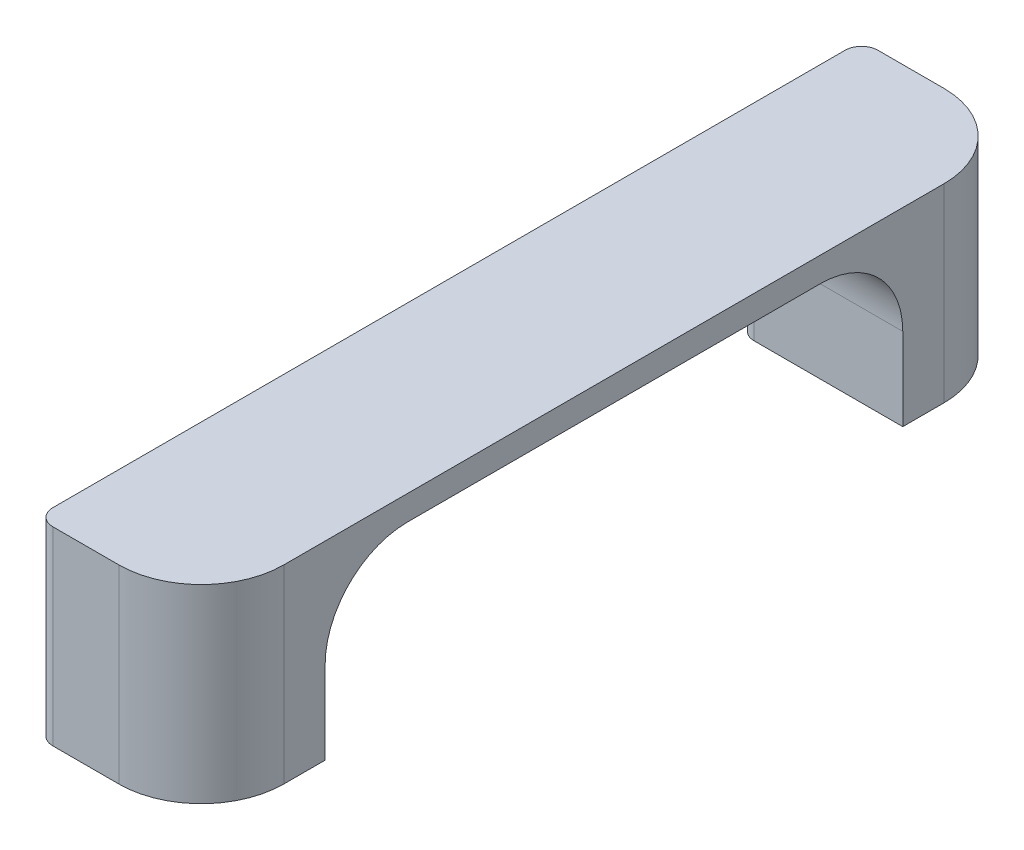
ISO-10303-21;
HEADER;
FILE_DESCRIPTION(('STEP AP214'),'2;1');
FILE_NAME('part.step','',(''),(''),'','','');
FILE_SCHEMA(('AUTOMOTIVE_DESIGN { 1 0 10303 214 1 1 1 1 }'));
ENDSEC;
DATA;
#1=APPLICATION_CONTEXT('core data for automotive mechanical design processes');
#2=APPLICATION_PROTOCOL_DEFINITION('international standard','automotive_design',2000,#1);
#3=PRODUCT_CONTEXT('',#1,'mechanical');
#4=PRODUCT('Part','Part','',(#3));
#5=PRODUCT_RELATED_PRODUCT_CATEGORY('part','',(#4));
#6=PRODUCT_DEFINITION_FORMATION('','',#4);
#7=PRODUCT_DEFINITION_CONTEXT('part definition',#1,'design');
#8=PRODUCT_DEFINITION('design','',#6,#7);
#9=PRODUCT_DEFINITION_SHAPE('','',#8);
#10=(LENGTH_UNIT() NAMED_UNIT(*) SI_UNIT(.MILLI.,.METRE.));
#11=(NAMED_UNIT(*) PLANE_ANGLE_UNIT() SI_UNIT($,.RADIAN.));
#12=(NAMED_UNIT(*) SI_UNIT($,.STERADIAN.) SOLID_ANGLE_UNIT());
#13=UNCERTAINTY_MEASURE_WITH_UNIT(LENGTH_MEASURE(1.E-05),#10,'distance_accuracy_value','');
#14=(GEOMETRIC_REPRESENTATION_CONTEXT(3) GLOBAL_UNCERTAINTY_ASSIGNED_CONTEXT((#13)) GLOBAL_UNIT_ASSIGNED_CONTEXT((#10,
#11,#12)) REPRESENTATION_CONTEXT('',''));
#15=CARTESIAN_POINT('',(0.,0.,0.));
#16=DIRECTION('',(0.,0.,1.));
#17=DIRECTION('',(1.,0.,0.));
#18=AXIS2_PLACEMENT_3D('',#15,#16,#17);
#19=CARTESIAN_POINT('',(0.,0.,0.));
#20=DIRECTION('',(0.,-1.,0.));
#21=DIRECTION('',(0.,0.,-1.));
#22=AXIS2_PLACEMENT_3D('',#19,#20,#21);
#23=PLANE('',#22);
#24=DIRECTION('',(0.,0.,1.));
#25=VECTOR('',#24,1.);
#26=CARTESIAN_POINT('',(0.,0.,0.));
#27=LINE('',#26,#25);
#28=CARTESIAN_POINT('',(0.,0.,-70.1678404338007));
#29=VERTEX_POINT('',#28);
#30=CARTESIAN_POINT('',(0.,0.,-19.8321595661992));
#31=VERTEX_POINT('',#30);
#32=EDGE_CURVE('E223',#29,#31,#27,.T.);
#33=ORIENTED_EDGE('',*,*,#32,.F.);
#34=CARTESIAN_POINT('',(1.99999999999998,0.,-82.));
#35=DIRECTION('',(0.,-1.,0.));
#36=DIRECTION('',(0.,0.,-1.));
#37=AXIS2_PLACEMENT_3D('',#34,#35,#36);
#38=CIRCLE('',#37,12.);
#39=CARTESIAN_POINT('',(1.99999999999998,0.,-70.));
#40=VERTEX_POINT('',#39);
#41=EDGE_CURVE('E303',#29,#40,#38,.F.);
#42=ORIENTED_EDGE('',*,*,#41,.T.);
#43=DIRECTION('',(-1.,0.,0.));
#44=VECTOR('',#43,1.);
#45=CARTESIAN_POINT('',(0.,0.,-70.));
#46=LINE('',#45,#44);
#47=CARTESIAN_POINT('',(20.,0.,-70.));
#48=VERTEX_POINT('',#47);
#49=EDGE_CURVE('E300',#40,#48,#46,.F.);
#50=ORIENTED_EDGE('',*,*,#49,.T.);
#51=DIRECTION('',(0.,0.,-1.));
#52=VECTOR('',#51,1.);
#53=CARTESIAN_POINT('',(20.,0.,0.));
#54=LINE('',#53,#52);
#55=CARTESIAN_POINT('',(20.,0.,-20.));
#56=VERTEX_POINT('',#55);
#57=EDGE_CURVE('E229',#56,#48,#54,.T.);
#58=ORIENTED_EDGE('',*,*,#57,.F.);
#59=DIRECTION('',(1.,0.,0.));
#60=VECTOR('',#59,1.);
#61=CARTESIAN_POINT('',(0.,0.,-20.));
#62=LINE('',#61,#60);
#63=CARTESIAN_POINT('',(2.,0.,-20.));
#64=VERTEX_POINT('',#63);
#65=EDGE_CURVE('E295',#56,#64,#62,.F.);
#66=ORIENTED_EDGE('',*,*,#65,.T.);
#67=CARTESIAN_POINT('',(2.,0.,-8.));
#68=DIRECTION('',(0.,-1.,0.));
#69=DIRECTION('',(0.,0.,-1.));
#70=AXIS2_PLACEMENT_3D('',#67,#68,#69);
#71=CIRCLE('',#70,12.);
#72=EDGE_CURVE('E297',#64,#31,#71,.F.);
#73=ORIENTED_EDGE('',*,*,#72,.T.);
#74=EDGE_LOOP('',(#33,#42,#50,#58,#66,#73));
#75=FACE_BOUND('',#74,.T.);
#76=ADVANCED_FACE('F41',(#75),#23,.T.);
#77=CARTESIAN_POINT('',(0.,3.,0.));
#78=DIRECTION('',(1.,0.,0.));
#79=DIRECTION('',(0.,0.,-1.));
#80=AXIS2_PLACEMENT_3D('',#77,#78,#79);
#81=PLANE('',#80);
#82=DIRECTION('',(0.,0.,-1.));
#83=VECTOR('',#82,1.);
#84=CARTESIAN_POINT('',(0.,-20.,0.));
#85=LINE('',#84,#83);
#86=CARTESIAN_POINT('',(0.,-20.,3.));
#87=VERTEX_POINT('',#86);
#88=CARTESIAN_POINT('',(0.,-20.,-8.));
#89=VERTEX_POINT('',#88);
#90=EDGE_CURVE('E211',#87,#89,#85,.T.);
#91=ORIENTED_EDGE('',*,*,#90,.F.);
#92=DIRECTION('',(0.,1.,0.));
#93=VECTOR('',#92,1.);
#94=CARTESIAN_POINT('',(0.,3.,3.));
#95=LINE('',#94,#93);
#96=CARTESIAN_POINT('',(0.,3.,3.));
#97=VERTEX_POINT('',#96);
#98=EDGE_CURVE('E267',#87,#97,#95,.T.);
#99=ORIENTED_EDGE('',*,*,#98,.T.);
#100=DIRECTION('',(0.,0.,1.));
#101=VECTOR('',#100,1.);
#102=CARTESIAN_POINT('',(0.,3.,0.));
#103=LINE('',#102,#101);
#104=CARTESIAN_POINT('',(0.,3.,-93.));
#105=VERTEX_POINT('',#104);
#106=EDGE_CURVE('E224',#105,#97,#103,.T.);
#107=ORIENTED_EDGE('',*,*,#106,.F.);
#108=DIRECTION('',(0.,1.,0.));
#109=VECTOR('',#108,1.);
#110=CARTESIAN_POINT('',(0.,-20.,-93.));
#111=LINE('',#110,#109);
#112=CARTESIAN_POINT('',(0.,-20.,-93.));
#113=VERTEX_POINT('',#112);
#114=EDGE_CURVE('E259',#105,#113,#111,.F.);
#115=ORIENTED_EDGE('',*,*,#114,.T.);
#116=DIRECTION('',(0.,0.,-1.));
#117=VECTOR('',#116,1.);
#118=CARTESIAN_POINT('',(0.,-20.,-90.));
#119=LINE('',#118,#117);
#120=CARTESIAN_POINT('',(0.,-20.,-82.));
#121=VERTEX_POINT('',#120);
#122=EDGE_CURVE('E201',#121,#113,#119,.T.);
#123=ORIENTED_EDGE('',*,*,#122,.F.);
#124=DIRECTION('',(0.,1.,0.));
#125=VECTOR('',#124,1.);
#126=CARTESIAN_POINT('',(0.,3.,-82.));
#127=LINE('',#126,#125);
#128=CARTESIAN_POINT('',(0.,-10.,-82.));
#129=VERTEX_POINT('',#128);
#130=EDGE_CURVE('E262',#121,#129,#127,.T.);
#131=ORIENTED_EDGE('',*,*,#130,.T.);
#132=CARTESIAN_POINT('',(0.,0.,-70.1678404338008));
#133=CARTESIAN_POINT('',(0.,2.10191415081182E-05,-70.4216609624393));
#134=CARTESIAN_POINT('',(0.,-0.00939418198005658,-70.6754685793764));
#135=CARTESIAN_POINT('',(0.,-0.0468394456368049,-71.1816480988663));
#136=CARTESIAN_POINT('',(0.,-0.0748650818075736,-71.4340203284241));
#137=CARTESIAN_POINT('',(0.,-0.149226810369676,-71.9357236716897));
#138=CARTESIAN_POINT('',(0.,-0.195539698017655,-72.1850582281866));
#139=CARTESIAN_POINT('',(0.,-0.306079157071367,-72.6797439580654));
#140=CARTESIAN_POINT('',(0.,-0.370307864719108,-72.9250946527266));
#141=CARTESIAN_POINT('',(0.,-0.527437110616089,-73.4480321232094));
#142=CARTESIAN_POINT('',(0.,-0.62323216760887,-73.7247532455665));
#143=CARTESIAN_POINT('',(0.,-0.837068688735033,-74.2694668622426));
#144=CARTESIAN_POINT('',(0.,-0.955112048587125,-74.5374586104709));
#145=CARTESIAN_POINT('',(0.,-1.21234150010652,-75.0631997515663));
#146=CARTESIAN_POINT('',(0.,-1.35153481445366,-75.3209456073946));
#147=CARTESIAN_POINT('',(0.,-1.64971285104091,-75.8247003285394));
#148=CARTESIAN_POINT('',(0.,-1.80869750674418,-76.0707092333108));
#149=CARTESIAN_POINT('',(0.,-2.15330502442141,-76.561689809982));
#150=CARTESIAN_POINT('',(0.,-2.33985588391826,-76.8060097765152));
#151=CARTESIAN_POINT('',(0.,-2.73129064220206,-77.2794756554535));
#152=CARTESIAN_POINT('',(0.,-2.93617543884392,-77.5086208237567));
#153=CARTESIAN_POINT('',(0.,-3.36228002974741,-77.9511187963036));
#154=CARTESIAN_POINT('',(0.,-3.58349902763464,-78.1644723694527));
#155=CARTESIAN_POINT('',(0.,-4.04021352179175,-78.5752419474623));
#156=CARTESIAN_POINT('',(0.,-4.27570832226231,-78.7726587279866));
#157=CARTESIAN_POINT('',(0.,-4.72070979725483,-79.121955559447));
#158=CARTESIAN_POINT('',(0.,-4.92844772588625,-79.2761034996471));
#159=CARTESIAN_POINT('',(0.,-5.35133788462005,-79.5738772645374));
#160=CARTESIAN_POINT('',(0.,-5.56649063685809,-79.7175023459956));
#161=CARTESIAN_POINT('',(0.,-6.00289683026443,-79.9949373439664));
#162=CARTESIAN_POINT('',(0.,-6.22414800720885,-80.1287508375475));
#163=CARTESIAN_POINT('',(0.,-6.67166291608455,-80.3876834714945));
#164=CARTESIAN_POINT('',(0.,-6.89792675741145,-80.5128024218648));
#165=CARTESIAN_POINT('',(0.,-7.52480673262205,-80.8463151793318));
#166=CARTESIAN_POINT('',(0.,-7.92944271616756,-81.0471205680418));
#167=CARTESIAN_POINT('',(0.,-8.74515020681244,-81.4347649429073));
#168=CARTESIAN_POINT('',(0.,-9.15622137932692,-81.621604652283));
#169=CARTESIAN_POINT('',(0.,-9.70592669129104,-81.8684757313831));
#170=CARTESIAN_POINT('',(0.,-9.84383253837145,-81.9301593362424));
#171=CARTESIAN_POINT('',(0.,-9.98782838700615,-81.9945566878116));
#172=CARTESIAN_POINT('',(0.,-9.99391419317435,-81.9972783430123));
#173=CARTESIAN_POINT('',(0.,-10.,-82.));
#174=B_SPLINE_CURVE_WITH_KNOTS('',3,(#132,#133,#134,#135,#136,#137,#138,#139,#140,#141,#142,
#143,#144,#145,#146,#147,#148,#149,#150,#151,#152,#153,#154,#155,#156,#157,#158,#159,#160,#161,
#162,#163,#164,#165,#166,#167,#168,#169,#170,#171,#172,#173),.UNSPECIFIED.,.F.,.F.,(4,2,2,2,2,2,
2,2,2,2,2,2,2,2,2,2,2,2,2,2,4),(0.,0.761267491588152,1.5223539857415,2.28247782270187,
3.04269233388829,3.92017736065048,4.79773718940725,5.67559737996917,6.55345461931779,
7.47468201635661,8.39595455272705,9.31718220205263,10.2383649870006,11.0140774355297,
11.7898446200946,12.5653275576832,13.3408274359997,14.6954553646361,16.0500130944704,
16.5032323799327,16.5232323799327),.UNSPECIFIED.);
#175=EDGE_CURVE('E316',#129,#29,#174,.F.);
#176=ORIENTED_EDGE('',*,*,#175,.T.);
#177=ORIENTED_EDGE('',*,*,#32,.T.);
#178=CARTESIAN_POINT('',(0.,0.,-19.8321595661992));
#179=CARTESIAN_POINT('',(0.,2.10191415088999E-05,-19.5783390375607));
#180=CARTESIAN_POINT('',(0.,-0.00939418198005515,-19.3245314206236));
#181=CARTESIAN_POINT('',(0.,-0.0468394456368029,-18.8183519011337));
#182=CARTESIAN_POINT('',(0.,-0.0748650818075717,-18.5659796715759));
#183=CARTESIAN_POINT('',(0.,-0.149226810369676,-18.0642763283103));
#184=CARTESIAN_POINT('',(0.,-0.195539698017655,-17.8149417718134));
#185=CARTESIAN_POINT('',(0.,-0.306079157071366,-17.3202560419346));
#186=CARTESIAN_POINT('',(0.,-0.370307864719105,-17.0749053472734));
#187=CARTESIAN_POINT('',(0.,-0.527437110616084,-16.5519678767906));
#188=CARTESIAN_POINT('',(0.,-0.623232167608868,-16.2752467544335));
#189=CARTESIAN_POINT('',(0.,-0.837068688735035,-15.7305331377574));
#190=CARTESIAN_POINT('',(0.,-0.955112048587129,-15.4625413895291));
#191=CARTESIAN_POINT('',(0.,-1.21234150010652,-14.9368002484337));
#192=CARTESIAN_POINT('',(0.,-1.35153481445366,-14.6790543926054));
#193=CARTESIAN_POINT('',(0.,-1.64971285104091,-14.1752996714606));
#194=CARTESIAN_POINT('',(0.,-1.80869750674418,-13.9292907666892));
#195=CARTESIAN_POINT('',(0.,-2.15330502442142,-13.438310190018));
#196=CARTESIAN_POINT('',(0.,-2.33985588391826,-13.1939902234848));
#197=CARTESIAN_POINT('',(0.,-2.73129064220206,-12.7205243445465));
#198=CARTESIAN_POINT('',(0.,-2.93617543884392,-12.4913791762433));
#199=CARTESIAN_POINT('',(0.,-3.36228002974741,-12.0488812036964));
#200=CARTESIAN_POINT('',(0.,-3.58349902763465,-11.8355276305473));
#201=CARTESIAN_POINT('',(0.,-4.04021352179176,-11.4247580525377));
#202=CARTESIAN_POINT('',(0.,-4.27570832226232,-11.2273412720134));
#203=CARTESIAN_POINT('',(0.,-4.72070979725484,-10.878044440553));
#204=CARTESIAN_POINT('',(0.,-4.92844772588626,-10.7238965003529));
#205=CARTESIAN_POINT('',(0.,-5.35133788462005,-10.4261227354626));
#206=CARTESIAN_POINT('',(0.,-5.56649063685809,-10.2824976540044));
#207=CARTESIAN_POINT('',(0.,-6.00289683026443,-10.0050626560336));
#208=CARTESIAN_POINT('',(0.,-6.22414800720885,-9.87124916245247));
#209=CARTESIAN_POINT('',(0.,-6.67166291608454,-9.61231652850553));
#210=CARTESIAN_POINT('',(0.,-6.89792675741145,-9.48719757813515));
#211=CARTESIAN_POINT('',(0.,-7.52480673262205,-9.1536848206682));
#212=CARTESIAN_POINT('',(0.,-7.92944271616756,-8.95287943195823));
#213=CARTESIAN_POINT('',(0.,-8.74515020681243,-8.5652350570927));
#214=CARTESIAN_POINT('',(0.,-9.1562213793269,-8.37839534771699));
#215=CARTESIAN_POINT('',(0.,-9.70592669129105,-8.13152426861689));
#216=CARTESIAN_POINT('',(0.,-9.84383253837147,-8.06984066375769));
#217=CARTESIAN_POINT('',(0.,-9.98782838700615,-8.00544331218838));
#218=CARTESIAN_POINT('',(0.,-9.99391419317435,-8.00272165698775));
#219=CARTESIAN_POINT('',(0.,-10.,-8.));
#220=B_SPLINE_CURVE_WITH_KNOTS('',3,(#178,#179,#180,#181,#182,#183,#184,#185,#186,#187,#188,
#189,#190,#191,#192,#193,#194,#195,#196,#197,#198,#199,#200,#201,#202,#203,#204,#205,#206,#207,
#208,#209,#210,#211,#212,#213,#214,#215,#216,#217,#218,#219),.UNSPECIFIED.,.F.,.F.,(4,2,2,2,2,2,
2,2,2,2,2,2,2,2,2,2,2,2,2,2,4),(0.,0.761267491588152,1.5223539857415,2.28247782270187,
3.04269233388829,3.92017736065048,4.79773718940725,5.67559737996917,6.5534546193178,
7.47468201635662,8.39595455272705,9.31718220205263,10.2383649870006,11.0140774355297,
11.7898446200946,12.5653275576832,13.3408274359997,14.6954553646361,16.0500130944704,
16.5032323799327,16.5232323799327),.UNSPECIFIED.);
#221=CARTESIAN_POINT('',(0.,-10.,-8.));
#222=VERTEX_POINT('',#221);
#223=EDGE_CURVE('E325',#31,#222,#220,.T.);
#224=ORIENTED_EDGE('',*,*,#223,.T.);
#225=DIRECTION('',(0.,1.,0.));
#226=VECTOR('',#225,1.);
#227=CARTESIAN_POINT('',(0.,3.,-8.));
#228=LINE('',#227,#226);
#229=EDGE_CURVE('E265',#222,#89,#228,.F.);
#230=ORIENTED_EDGE('',*,*,#229,.T.);
#231=EDGE_LOOP('',(#91,#99,#107,#115,#123,#131,#176,#177,#224,#230));
#232=FACE_BOUND('',#231,.T.);
#233=ADVANCED_FACE('F335',(#232),#81,.F.);
#234=CARTESIAN_POINT('',(20.,3.,0.));
#235=DIRECTION('',(-1.,0.,0.));
#236=DIRECTION('',(0.,0.,1.));
#237=AXIS2_PLACEMENT_3D('',#234,#235,#236);
#238=PLANE('',#237);
#239=DIRECTION('',(0.,0.,-1.));
#240=VECTOR('',#239,1.);
#241=CARTESIAN_POINT('',(20.,3.,0.));
#242=LINE('',#241,#240);
#243=CARTESIAN_POINT('',(20.,3.,-5.));
#244=VERTEX_POINT('',#243);
#245=CARTESIAN_POINT('',(20.,3.,-85.));
#246=VERTEX_POINT('',#245);
#247=EDGE_CURVE('E228',#244,#246,#242,.T.);
#248=ORIENTED_EDGE('',*,*,#247,.F.);
#249=DIRECTION('',(0.,1.,0.));
#250=VECTOR('',#249,1.);
#251=CARTESIAN_POINT('',(20.,-20.,-5.));
#252=LINE('',#251,#250);
#253=CARTESIAN_POINT('',(20.,-20.,-5.));
#254=VERTEX_POINT('',#253);
#255=EDGE_CURVE('E249',#244,#254,#252,.F.);
#256=ORIENTED_EDGE('',*,*,#255,.T.);
#257=DIRECTION('',(0.,0.,1.));
#258=VECTOR('',#257,1.);
#259=CARTESIAN_POINT('',(20.,-20.,0.));
#260=LINE('',#259,#258);
#261=CARTESIAN_POINT('',(20.,-20.,-10.));
#262=VERTEX_POINT('',#261);
#263=EDGE_CURVE('E206',#262,#254,#260,.T.);
#264=ORIENTED_EDGE('',*,*,#263,.F.);
#265=DIRECTION('',(0.,1.,0.));
#266=VECTOR('',#265,1.);
#267=CARTESIAN_POINT('',(20.,-20.,-10.));
#268=LINE('',#267,#266);
#269=CARTESIAN_POINT('',(20.,-10.,-10.));
#270=VERTEX_POINT('',#269);
#271=EDGE_CURVE('E221',#262,#270,#268,.T.);
#272=ORIENTED_EDGE('',*,*,#271,.T.);
#273=CARTESIAN_POINT('',(20.,-10.,-20.));
#274=DIRECTION('',(-1.,0.,0.));
#275=DIRECTION('',(0.,0.,1.));
#276=AXIS2_PLACEMENT_3D('',#273,#274,#275);
#277=CIRCLE('',#276,10.);
#278=EDGE_CURVE('E11',#270,#56,#277,.T.);
#279=ORIENTED_EDGE('',*,*,#278,.T.);
#280=ORIENTED_EDGE('',*,*,#57,.T.);
#281=CARTESIAN_POINT('',(20.,-10.,-70.));
#282=DIRECTION('',(-1.,0.,0.));
#283=DIRECTION('',(0.,0.,1.));
#284=AXIS2_PLACEMENT_3D('',#281,#282,#283);
#285=CIRCLE('',#284,10.);
#286=CARTESIAN_POINT('',(20.,-10.,-80.));
#287=VERTEX_POINT('',#286);
#288=EDGE_CURVE('E50',#48,#287,#285,.T.);
#289=ORIENTED_EDGE('',*,*,#288,.T.);
#290=DIRECTION('',(0.,1.,0.));
#291=VECTOR('',#290,1.);
#292=CARTESIAN_POINT('',(20.,-20.,-80.));
#293=LINE('',#292,#291);
#294=CARTESIAN_POINT('',(20.,-20.,-80.));
#295=VERTEX_POINT('',#294);
#296=EDGE_CURVE('E196',#295,#287,#293,.T.);
#297=ORIENTED_EDGE('',*,*,#296,.F.);
#298=DIRECTION('',(0.,0.,1.));
#299=VECTOR('',#298,1.);
#300=CARTESIAN_POINT('',(20.,-20.,-90.));
#301=LINE('',#300,#299);
#302=CARTESIAN_POINT('',(20.,-20.,-85.));
#303=VERTEX_POINT('',#302);
#304=EDGE_CURVE('E181',#303,#295,#301,.T.);
#305=ORIENTED_EDGE('',*,*,#304,.F.);
#306=DIRECTION('',(0.,1.,0.));
#307=VECTOR('',#306,1.);
#308=CARTESIAN_POINT('',(20.,3.,-85.));
#309=LINE('',#308,#307);
#310=EDGE_CURVE('E246',#303,#246,#309,.T.);
#311=ORIENTED_EDGE('',*,*,#310,.T.);
#312=EDGE_LOOP('',(#248,#256,#264,#272,#279,#280,#289,#297,#305,#311));
#313=FACE_BOUND('',#312,.T.);
#314=ADVANCED_FACE('F204',(#313),#238,.F.);
#315=CARTESIAN_POINT('',(0.,3.,0.));
#316=DIRECTION('',(0.,-1.,0.));
#317=DIRECTION('',(0.,0.,-1.));
#318=AXIS2_PLACEMENT_3D('',#315,#316,#317);
#319=PLANE('',#318);
#320=ORIENTED_EDGE('',*,*,#106,.T.);
#321=CARTESIAN_POINT('',(2.,3.,3.));
#322=DIRECTION('',(0.,-1.,0.));
#323=DIRECTION('',(0.,0.,-1.));
#324=AXIS2_PLACEMENT_3D('',#321,#322,#323);
#325=CIRCLE('',#324,2.);
#326=CARTESIAN_POINT('',(2.,3.,5.));
#327=VERTEX_POINT('',#326);
#328=EDGE_CURVE('E273',#97,#327,#325,.F.);
#329=ORIENTED_EDGE('',*,*,#328,.T.);
#330=DIRECTION('',(1.,0.,0.));
#331=VECTOR('',#330,1.);
#332=CARTESIAN_POINT('',(0.,3.,5.));
#333=LINE('',#332,#331);
#334=CARTESIAN_POINT('',(9.99999999999999,3.,5.));
#335=VERTEX_POINT('',#334);
#336=EDGE_CURVE('E419',#327,#335,#333,.T.);
#337=ORIENTED_EDGE('',*,*,#336,.T.);
#338=CARTESIAN_POINT('',(9.99999999999999,3.,-5.));
#339=DIRECTION('',(0.,-1.,0.));
#340=DIRECTION('',(0.,0.,-1.));
#341=AXIS2_PLACEMENT_3D('',#338,#339,#340);
#342=CIRCLE('',#341,10.);
#343=EDGE_CURVE('E244',#335,#244,#342,.F.);
#344=ORIENTED_EDGE('',*,*,#343,.T.);
#345=ORIENTED_EDGE('',*,*,#247,.T.);
#346=CARTESIAN_POINT('',(9.99999999999998,3.,-85.));
#347=DIRECTION('',(0.,-1.,0.));
#348=DIRECTION('',(0.,0.,-1.));
#349=AXIS2_PLACEMENT_3D('',#346,#347,#348);
#350=CIRCLE('',#349,10.);
#351=CARTESIAN_POINT('',(9.99999999999998,3.,-95.));
#352=VERTEX_POINT('',#351);
#353=EDGE_CURVE('E241',#246,#352,#350,.F.);
#354=ORIENTED_EDGE('',*,*,#353,.T.);
#355=DIRECTION('',(-1.,0.,0.));
#356=VECTOR('',#355,1.);
#357=CARTESIAN_POINT('',(20.,3.,-95.));
#358=LINE('',#357,#356);
#359=CARTESIAN_POINT('',(1.99999999999998,3.,-95.));
#360=VERTEX_POINT('',#359);
#361=EDGE_CURVE('E450',#352,#360,#358,.T.);
#362=ORIENTED_EDGE('',*,*,#361,.T.);
#363=CARTESIAN_POINT('',(1.99999999999998,3.,-93.));
#364=DIRECTION('',(0.,-1.,0.));
#365=DIRECTION('',(0.,0.,-1.));
#366=AXIS2_PLACEMENT_3D('',#363,#364,#365);
#367=CIRCLE('',#366,2.);
#368=EDGE_CURVE('E270',#360,#105,#367,.F.);
#369=ORIENTED_EDGE('',*,*,#368,.T.);
#370=EDGE_LOOP('',(#320,#329,#337,#344,#345,#354,#362,#369));
#371=FACE_BOUND('',#370,.T.);
#372=ADVANCED_FACE('F378',(#371),#319,.F.);
#373=CARTESIAN_POINT('',(20.,-20.,-10.));
#374=DIRECTION('',(0.,0.,1.));
#375=DIRECTION('',(1.,0.,0.));
#376=AXIS2_PLACEMENT_3D('',#373,#374,#375);
#377=PLANE('',#376);
#378=DIRECTION('',(0.,1.,0.));
#379=VECTOR('',#378,1.);
#380=CARTESIAN_POINT('',(2.,-20.,-10.));
#381=LINE('',#380,#379);
#382=CARTESIAN_POINT('',(2.,-20.,-10.));
#383=VERTEX_POINT('',#382);
#384=CARTESIAN_POINT('',(2.,-10.,-10.));
#385=VERTEX_POINT('',#384);
#386=EDGE_CURVE('E281',#383,#385,#381,.T.);
#387=ORIENTED_EDGE('',*,*,#386,.T.);
#388=DIRECTION('',(1.,0.,0.));
#389=VECTOR('',#388,1.);
#390=CARTESIAN_POINT('',(20.,-10.,-10.));
#391=LINE('',#390,#389);
#392=EDGE_CURVE('E58',#385,#270,#391,.T.);
#393=ORIENTED_EDGE('',*,*,#392,.T.);
#394=ORIENTED_EDGE('',*,*,#271,.F.);
#395=DIRECTION('',(1.,0.,0.));
#396=VECTOR('',#395,1.);
#397=CARTESIAN_POINT('',(20.,-20.,-10.));
#398=LINE('',#397,#396);
#399=EDGE_CURVE('E219',#383,#262,#398,.T.);
#400=ORIENTED_EDGE('',*,*,#399,.F.);
#401=EDGE_LOOP('',(#387,#393,#394,#400));
#402=FACE_BOUND('',#401,.T.);
#403=ADVANCED_FACE('F381',(#402),#377,.F.);
#404=CARTESIAN_POINT('',(0.,-20.,0.));
#405=DIRECTION('',(0.,1.,0.));
#406=DIRECTION('',(0.,0.,1.));
#407=AXIS2_PLACEMENT_3D('',#404,#405,#406);
#408=PLANE('',#407);
#409=CARTESIAN_POINT('',(12.,-20.,-5.));
#410=DIRECTION('',(0.,-1.,0.));
#411=DIRECTION('',(0.,0.,-1.));
#412=AXIS2_PLACEMENT_3D('',#409,#410,#411);
#413=CIRCLE('',#412,2.1);
#414=CARTESIAN_POINT('',(12.,-20.,-7.1));
#415=VERTEX_POINT('',#414);
#416=EDGE_CURVE('E463',#415,#415,#413,.T.);
#417=ORIENTED_EDGE('',*,*,#416,.F.);
#418=EDGE_LOOP('',(#417));
#419=FACE_BOUND('',#418,.T.);
#420=DIRECTION('',(1.,0.,0.));
#421=VECTOR('',#420,1.);
#422=CARTESIAN_POINT('',(0.,-20.,5.));
#423=LINE('',#422,#421);
#424=CARTESIAN_POINT('',(2.,-20.,5.));
#425=VERTEX_POINT('',#424);
#426=CARTESIAN_POINT('',(9.99999999999999,-20.,5.));
#427=VERTEX_POINT('',#426);
#428=EDGE_CURVE('E424',#425,#427,#423,.T.);
#429=ORIENTED_EDGE('',*,*,#428,.F.);
#430=CARTESIAN_POINT('',(2.,-20.,3.));
#431=DIRECTION('',(0.,1.,0.));
#432=DIRECTION('',(0.,0.,1.));
#433=AXIS2_PLACEMENT_3D('',#430,#431,#432);
#434=CIRCLE('',#433,2.);
#435=EDGE_CURVE('E279',#425,#87,#434,.F.);
#436=ORIENTED_EDGE('',*,*,#435,.T.);
#437=ORIENTED_EDGE('',*,*,#90,.T.);
#438=CARTESIAN_POINT('',(2.,-20.,-8.));
#439=DIRECTION('',(0.,1.,0.));
#440=DIRECTION('',(0.,0.,1.));
#441=AXIS2_PLACEMENT_3D('',#438,#439,#440);
#442=CIRCLE('',#441,2.);
#443=EDGE_CURVE('E277',#89,#383,#442,.F.);
#444=ORIENTED_EDGE('',*,*,#443,.T.);
#445=ORIENTED_EDGE('',*,*,#399,.T.);
#446=ORIENTED_EDGE('',*,*,#263,.T.);
#447=CARTESIAN_POINT('',(9.99999999999999,-20.,-5.));
#448=DIRECTION('',(0.,1.,0.));
#449=DIRECTION('',(0.,0.,1.));
#450=AXIS2_PLACEMENT_3D('',#447,#448,#449);
#451=CIRCLE('',#450,10.);
#452=EDGE_CURVE('E251',#254,#427,#451,.F.);
#453=ORIENTED_EDGE('',*,*,#452,.T.);
#454=EDGE_LOOP('',(#429,#436,#437,#444,#445,#446,#453));
#455=FACE_BOUND('',#454,.T.);
#456=ADVANCED_FACE('F385',(#419,#455),#408,.F.);
#457=CARTESIAN_POINT('',(20.,-20.,-80.));
#458=DIRECTION('',(0.,0.,-1.));
#459=DIRECTION('',(-1.,0.,0.));
#460=AXIS2_PLACEMENT_3D('',#457,#458,#459);
#461=PLANE('',#460);
#462=ORIENTED_EDGE('',*,*,#296,.T.);
#463=DIRECTION('',(-1.,0.,0.));
#464=VECTOR('',#463,1.);
#465=CARTESIAN_POINT('',(20.,-10.,-80.));
#466=LINE('',#465,#464);
#467=CARTESIAN_POINT('',(1.99999999999998,-10.,-80.));
#468=VERTEX_POINT('',#467);
#469=EDGE_CURVE('E312',#287,#468,#466,.T.);
#470=ORIENTED_EDGE('',*,*,#469,.T.);
#471=DIRECTION('',(0.,1.,0.));
#472=VECTOR('',#471,1.);
#473=CARTESIAN_POINT('',(1.99999999999998,-20.,-80.));
#474=LINE('',#473,#472);
#475=CARTESIAN_POINT('',(1.99999999999998,-20.,-80.));
#476=VERTEX_POINT('',#475);
#477=EDGE_CURVE('E199',#468,#476,#474,.F.);
#478=ORIENTED_EDGE('',*,*,#477,.T.);
#479=DIRECTION('',(-1.,0.,0.));
#480=VECTOR('',#479,1.);
#481=CARTESIAN_POINT('',(20.,-20.,-80.));
#482=LINE('',#481,#480);
#483=EDGE_CURVE('E184',#295,#476,#482,.T.);
#484=ORIENTED_EDGE('',*,*,#483,.F.);
#485=EDGE_LOOP('',(#462,#470,#478,#484));
#486=FACE_BOUND('',#485,.T.);
#487=ADVANCED_FACE('F195',(#486),#461,.F.);
#488=CARTESIAN_POINT('',(0.,-20.,0.));
#489=DIRECTION('',(0.,-1.,0.));
#490=DIRECTION('',(0.,0.,-1.));
#491=AXIS2_PLACEMENT_3D('',#488,#489,#490);
#492=PLANE('',#491);
#493=CARTESIAN_POINT('',(12.,-20.,-85.));
#494=DIRECTION('',(0.,-1.,0.));
#495=DIRECTION('',(0.,0.,-1.));
#496=AXIS2_PLACEMENT_3D('',#493,#494,#495);
#497=CIRCLE('',#496,2.1);
#498=CARTESIAN_POINT('',(12.,-20.,-87.1));
#499=VERTEX_POINT('',#498);
#500=EDGE_CURVE('E457',#499,#499,#497,.T.);
#501=ORIENTED_EDGE('',*,*,#500,.F.);
#502=EDGE_LOOP('',(#501));
#503=FACE_BOUND('',#502,.T.);
#504=ORIENTED_EDGE('',*,*,#483,.T.);
#505=CARTESIAN_POINT('',(1.99999999999998,-20.,-82.));
#506=DIRECTION('',(0.,-1.,0.));
#507=DIRECTION('',(0.,0.,-1.));
#508=AXIS2_PLACEMENT_3D('',#505,#506,#507);
#509=CIRCLE('',#508,2.);
#510=EDGE_CURVE('E288',#476,#121,#509,.T.);
#511=ORIENTED_EDGE('',*,*,#510,.T.);
#512=ORIENTED_EDGE('',*,*,#122,.T.);
#513=CARTESIAN_POINT('',(1.99999999999998,-20.,-93.));
#514=DIRECTION('',(0.,-1.,0.));
#515=DIRECTION('',(0.,0.,-1.));
#516=AXIS2_PLACEMENT_3D('',#513,#514,#515);
#517=CIRCLE('',#516,2.);
#518=CARTESIAN_POINT('',(1.99999999999998,-20.,-95.));
#519=VERTEX_POINT('',#518);
#520=EDGE_CURVE('E285',#113,#519,#517,.T.);
#521=ORIENTED_EDGE('',*,*,#520,.T.);
#522=DIRECTION('',(-1.,0.,0.));
#523=VECTOR('',#522,1.);
#524=CARTESIAN_POINT('',(20.,-20.,-95.));
#525=LINE('',#524,#523);
#526=CARTESIAN_POINT('',(9.99999999999998,-20.,-95.));
#527=VERTEX_POINT('',#526);
#528=EDGE_CURVE('E452',#527,#519,#525,.T.);
#529=ORIENTED_EDGE('',*,*,#528,.F.);
#530=CARTESIAN_POINT('',(9.99999999999998,-20.,-85.));
#531=DIRECTION('',(0.,-1.,0.));
#532=DIRECTION('',(0.,0.,-1.));
#533=AXIS2_PLACEMENT_3D('',#530,#531,#532);
#534=CIRCLE('',#533,10.);
#535=EDGE_CURVE('E188',#527,#303,#534,.T.);
#536=ORIENTED_EDGE('',*,*,#535,.T.);
#537=ORIENTED_EDGE('',*,*,#304,.T.);
#538=EDGE_LOOP('',(#504,#511,#512,#521,#529,#536,#537));
#539=FACE_BOUND('',#538,.T.);
#540=ADVANCED_FACE('F183',(#503,#539),#492,.T.);
#541=CARTESIAN_POINT('',(12.,-16.,-85.));
#542=DIRECTION('',(0.,-1.,0.));
#543=DIRECTION('',(0.,0.,-1.));
#544=AXIS2_PLACEMENT_3D('',#541,#542,#543);
#545=CYLINDRICAL_SURFACE('',#544,2.1);
#546=CARTESIAN_POINT('',(12.,-16.,-85.));
#547=DIRECTION('',(0.,-1.,0.));
#548=DIRECTION('',(0.,0.,-1.));
#549=AXIS2_PLACEMENT_3D('',#546,#547,#548);
#550=CIRCLE('',#549,2.1);
#551=CARTESIAN_POINT('',(12.,-16.,-87.1));
#552=VERTEX_POINT('',#551);
#553=EDGE_CURVE('E466',#552,#552,#550,.T.);
#554=ORIENTED_EDGE('',*,*,#553,.F.);
#555=EDGE_LOOP('',(#554));
#556=FACE_BOUND('',#555,.T.);
#557=ORIENTED_EDGE('',*,*,#500,.T.);
#558=EDGE_LOOP('',(#557));
#559=FACE_BOUND('',#558,.T.);
#560=ADVANCED_FACE('F393',(#556,#559),#545,.F.);
#561=CARTESIAN_POINT('',(12.,-16.,-85.));
#562=DIRECTION('',(0.,-1.,0.));
#563=DIRECTION('',(0.,0.,-1.));
#564=AXIS2_PLACEMENT_3D('',#561,#562,#563);
#565=PLANE('',#564);
#566=ORIENTED_EDGE('',*,*,#553,.T.);
#567=EDGE_LOOP('',(#566));
#568=FACE_BOUND('',#567,.T.);
#569=ADVANCED_FACE('F397',(#568),#565,.T.);
#570=CARTESIAN_POINT('',(12.,-16.,-5.));
#571=DIRECTION('',(0.,-1.,0.));
#572=DIRECTION('',(0.,0.,-1.));
#573=AXIS2_PLACEMENT_3D('',#570,#571,#572);
#574=CYLINDRICAL_SURFACE('',#573,2.1);
#575=CARTESIAN_POINT('',(12.,-16.,-5.));
#576=DIRECTION('',(0.,-1.,0.));
#577=DIRECTION('',(0.,0.,-1.));
#578=AXIS2_PLACEMENT_3D('',#575,#576,#577);
#579=CIRCLE('',#578,2.1);
#580=CARTESIAN_POINT('',(12.,-16.,-7.1));
#581=VERTEX_POINT('',#580);
#582=EDGE_CURVE('E192',#581,#581,#579,.T.);
#583=ORIENTED_EDGE('',*,*,#582,.F.);
#584=EDGE_LOOP('',(#583));
#585=FACE_BOUND('',#584,.T.);
#586=ORIENTED_EDGE('',*,*,#416,.T.);
#587=EDGE_LOOP('',(#586));
#588=FACE_BOUND('',#587,.T.);
#589=ADVANCED_FACE('F401',(#585,#588),#574,.F.);
#590=CARTESIAN_POINT('',(12.,-16.,-5.));
#591=DIRECTION('',(0.,-1.,0.));
#592=DIRECTION('',(0.,0.,-1.));
#593=AXIS2_PLACEMENT_3D('',#590,#591,#592);
#594=PLANE('',#593);
#595=ORIENTED_EDGE('',*,*,#582,.T.);
#596=EDGE_LOOP('',(#595));
#597=FACE_BOUND('',#596,.T.);
#598=ADVANCED_FACE('F405',(#597),#594,.T.);
#599=CARTESIAN_POINT('',(20.,-40.6155281280883,-95.));
#600=DIRECTION('',(0.,0.,-1.));
#601=DIRECTION('',(-1.,0.,0.));
#602=AXIS2_PLACEMENT_3D('',#599,#600,#601);
#603=PLANE('',#602);
#604=ORIENTED_EDGE('',*,*,#528,.T.);
#605=DIRECTION('',(0.,1.,0.));
#606=VECTOR('',#605,1.);
#607=CARTESIAN_POINT('',(1.99999999999998,3.,-95.));
#608=LINE('',#607,#606);
#609=EDGE_CURVE('E291',#519,#360,#608,.T.);
#610=ORIENTED_EDGE('',*,*,#609,.T.);
#611=ORIENTED_EDGE('',*,*,#361,.F.);
#612=DIRECTION('',(0.,1.,0.));
#613=VECTOR('',#612,1.);
#614=CARTESIAN_POINT('',(9.99999999999998,-20.,-95.));
#615=LINE('',#614,#613);
#616=EDGE_CURVE('E254',#352,#527,#615,.F.);
#617=ORIENTED_EDGE('',*,*,#616,.T.);
#618=EDGE_LOOP('',(#604,#610,#611,#617));
#619=FACE_BOUND('',#618,.T.);
#620=ADVANCED_FACE('F409',(#619),#603,.T.);
#621=CARTESIAN_POINT('',(0.,-40.6155281280883,5.));
#622=DIRECTION('',(0.,0.,1.));
#623=DIRECTION('',(1.,0.,0.));
#624=AXIS2_PLACEMENT_3D('',#621,#622,#623);
#625=PLANE('',#624);
#626=ORIENTED_EDGE('',*,*,#336,.F.);
#627=DIRECTION('',(0.,1.,0.));
#628=VECTOR('',#627,1.);
#629=CARTESIAN_POINT('',(2.,-20.,5.));
#630=LINE('',#629,#628);
#631=EDGE_CURVE('E275',#327,#425,#630,.F.);
#632=ORIENTED_EDGE('',*,*,#631,.T.);
#633=ORIENTED_EDGE('',*,*,#428,.T.);
#634=DIRECTION('',(0.,1.,0.));
#635=VECTOR('',#634,1.);
#636=CARTESIAN_POINT('',(9.99999999999999,3.,5.));
#637=LINE('',#636,#635);
#638=EDGE_CURVE('E233',#427,#335,#637,.T.);
#639=ORIENTED_EDGE('',*,*,#638,.T.);
#640=EDGE_LOOP('',(#626,#632,#633,#639));
#641=FACE_BOUND('',#640,.T.);
#642=ADVANCED_FACE('F347',(#641),#625,.T.);
#643=CARTESIAN_POINT('',(9.99999999999999,-40.6155281280883,-5.));
#644=DIRECTION('',(0.,-1.,0.));
#645=DIRECTION('',(0.,0.,-1.));
#646=AXIS2_PLACEMENT_3D('',#643,#644,#645);
#647=CYLINDRICAL_SURFACE('',#646,10.);
#648=ORIENTED_EDGE('',*,*,#452,.F.);
#649=ORIENTED_EDGE('',*,*,#255,.F.);
#650=ORIENTED_EDGE('',*,*,#343,.F.);
#651=ORIENTED_EDGE('',*,*,#638,.F.);
#652=EDGE_LOOP('',(#648,#649,#650,#651));
#653=FACE_BOUND('',#652,.T.);
#654=ADVANCED_FACE('F342',(#653),#647,.T.);
#655=CARTESIAN_POINT('',(9.99999999999998,3.,-85.));
#656=DIRECTION('',(0.,-1.,0.));
#657=DIRECTION('',(0.,0.,-1.));
#658=AXIS2_PLACEMENT_3D('',#655,#656,#657);
#659=CYLINDRICAL_SURFACE('',#658,10.);
#660=ORIENTED_EDGE('',*,*,#535,.F.);
#661=ORIENTED_EDGE('',*,*,#616,.F.);
#662=ORIENTED_EDGE('',*,*,#353,.F.);
#663=ORIENTED_EDGE('',*,*,#310,.F.);
#664=EDGE_LOOP('',(#660,#661,#662,#663));
#665=FACE_BOUND('',#664,.T.);
#666=ADVANCED_FACE('F346',(#665),#659,.T.);
#667=CARTESIAN_POINT('',(2.,3.,3.));
#668=DIRECTION('',(0.,-1.,0.));
#669=DIRECTION('',(0.,0.,-1.));
#670=AXIS2_PLACEMENT_3D('',#667,#668,#669);
#671=CYLINDRICAL_SURFACE('',#670,2.);
#672=ORIENTED_EDGE('',*,*,#435,.F.);
#673=ORIENTED_EDGE('',*,*,#631,.F.);
#674=ORIENTED_EDGE('',*,*,#328,.F.);
#675=ORIENTED_EDGE('',*,*,#98,.F.);
#676=EDGE_LOOP('',(#672,#673,#674,#675));
#677=FACE_BOUND('',#676,.T.);
#678=ADVANCED_FACE('F351',(#677),#671,.T.);
#679=CARTESIAN_POINT('',(2.,-20.,-8.));
#680=DIRECTION('',(0.,1.,0.));
#681=DIRECTION('',(0.,0.,1.));
#682=AXIS2_PLACEMENT_3D('',#679,#680,#681);
#683=CYLINDRICAL_SURFACE('',#682,2.);
#684=ORIENTED_EDGE('',*,*,#229,.F.);
#685=CARTESIAN_POINT('',(2.,-10.,-8.));
#686=DIRECTION('',(0.,-1.,0.));
#687=DIRECTION('',(0.,0.,-1.));
#688=AXIS2_PLACEMENT_3D('',#685,#686,#687);
#689=CIRCLE('',#688,2.);
#690=EDGE_CURVE('E310',#222,#385,#689,.T.);
#691=ORIENTED_EDGE('',*,*,#690,.T.);
#692=ORIENTED_EDGE('',*,*,#386,.F.);
#693=ORIENTED_EDGE('',*,*,#443,.F.);
#694=EDGE_LOOP('',(#684,#691,#692,#693));
#695=FACE_BOUND('',#694,.T.);
#696=ADVANCED_FACE('F355',(#695),#683,.T.);
#697=CARTESIAN_POINT('',(1.99999999999998,3.,-82.));
#698=DIRECTION('',(0.,1.,0.));
#699=DIRECTION('',(0.,0.,1.));
#700=AXIS2_PLACEMENT_3D('',#697,#698,#699);
#701=CYLINDRICAL_SURFACE('',#700,2.);
#702=ORIENTED_EDGE('',*,*,#477,.F.);
#703=CARTESIAN_POINT('',(1.99999999999998,-10.,-82.));
#704=DIRECTION('',(0.,-1.,0.));
#705=DIRECTION('',(0.,0.,-1.));
#706=AXIS2_PLACEMENT_3D('',#703,#704,#705);
#707=CIRCLE('',#706,2.);
#708=EDGE_CURVE('E307',#468,#129,#707,.T.);
#709=ORIENTED_EDGE('',*,*,#708,.T.);
#710=ORIENTED_EDGE('',*,*,#130,.F.);
#711=ORIENTED_EDGE('',*,*,#510,.F.);
#712=EDGE_LOOP('',(#702,#709,#710,#711));
#713=FACE_BOUND('',#712,.T.);
#714=ADVANCED_FACE('F359',(#713),#701,.T.);
#715=CARTESIAN_POINT('',(1.99999999999998,-40.6155281280883,-93.));
#716=DIRECTION('',(0.,-1.,0.));
#717=DIRECTION('',(0.,0.,-1.));
#718=AXIS2_PLACEMENT_3D('',#715,#716,#717);
#719=CYLINDRICAL_SURFACE('',#718,2.);
#720=ORIENTED_EDGE('',*,*,#520,.F.);
#721=ORIENTED_EDGE('',*,*,#114,.F.);
#722=ORIENTED_EDGE('',*,*,#368,.F.);
#723=ORIENTED_EDGE('',*,*,#609,.F.);
#724=EDGE_LOOP('',(#720,#721,#722,#723));
#725=FACE_BOUND('',#724,.T.);
#726=ADVANCED_FACE('F362',(#725),#719,.T.);
#727=CARTESIAN_POINT('',(20.,-10.,-70.));
#728=DIRECTION('',(-1.,0.,0.));
#729=DIRECTION('',(0.,0.,1.));
#730=AXIS2_PLACEMENT_3D('',#727,#728,#729);
#731=CYLINDRICAL_SURFACE('',#730,10.);
#732=ORIENTED_EDGE('',*,*,#288,.F.);
#733=ORIENTED_EDGE('',*,*,#49,.F.);
#734=CARTESIAN_POINT('',(1.99999999999998,-10.,-70.));
#735=DIRECTION('',(1.,0.,0.));
#736=DIRECTION('',(0.,0.,-1.));
#737=AXIS2_PLACEMENT_3D('',#734,#735,#736);
#738=CIRCLE('',#737,10.);
#739=EDGE_CURVE('E425',#468,#40,#738,.T.);
#740=ORIENTED_EDGE('',*,*,#739,.F.);
#741=ORIENTED_EDGE('',*,*,#469,.F.);
#742=EDGE_LOOP('',(#732,#733,#740,#741));
#743=FACE_BOUND('',#742,.T.);
#744=ADVANCED_FACE('F365',(#743),#731,.F.);
#745=CARTESIAN_POINT('',(1.99999999999998,-10.,-82.));
#746=DIRECTION('',(0.,-1.,0.));
#747=DIRECTION('',(0.,0.,-1.));
#748=AXIS2_PLACEMENT_3D('',#745,#746,#747);
#749=TOROIDAL_SURFACE('',#748,12.,10.);
#750=ORIENTED_EDGE('',*,*,#175,.F.);
#751=ORIENTED_EDGE('',*,*,#708,.F.);
#752=ORIENTED_EDGE('',*,*,#739,.T.);
#753=ORIENTED_EDGE('',*,*,#41,.F.);
#754=EDGE_LOOP('',(#750,#751,#752,#753));
#755=FACE_BOUND('',#754,.T.);
#756=ADVANCED_FACE('F331',(#755),#749,.F.);
#757=CARTESIAN_POINT('',(20.,-10.,-20.));
#758=DIRECTION('',(1.,0.,0.));
#759=DIRECTION('',(0.,0.,-1.));
#760=AXIS2_PLACEMENT_3D('',#757,#758,#759);
#761=CYLINDRICAL_SURFACE('',#760,10.);
#762=ORIENTED_EDGE('',*,*,#278,.F.);
#763=ORIENTED_EDGE('',*,*,#392,.F.);
#764=CARTESIAN_POINT('',(2.,-10.,-20.));
#765=DIRECTION('',(1.,0.,0.));
#766=DIRECTION('',(0.,0.,-1.));
#767=AXIS2_PLACEMENT_3D('',#764,#765,#766);
#768=CIRCLE('',#767,10.);
#769=EDGE_CURVE('E45',#64,#385,#768,.T.);
#770=ORIENTED_EDGE('',*,*,#769,.F.);
#771=ORIENTED_EDGE('',*,*,#65,.F.);
#772=EDGE_LOOP('',(#762,#763,#770,#771));
#773=FACE_BOUND('',#772,.T.);
#774=ADVANCED_FACE('F43',(#773),#761,.F.);
#775=CARTESIAN_POINT('',(2.,-10.,-8.));
#776=DIRECTION('',(0.,-1.,0.));
#777=DIRECTION('',(0.,0.,-1.));
#778=AXIS2_PLACEMENT_3D('',#775,#776,#777);
#779=TOROIDAL_SURFACE('',#778,12.,10.);
#780=ORIENTED_EDGE('',*,*,#769,.T.);
#781=ORIENTED_EDGE('',*,*,#690,.F.);
#782=ORIENTED_EDGE('',*,*,#223,.F.);
#783=ORIENTED_EDGE('',*,*,#72,.F.);
#784=EDGE_LOOP('',(#780,#781,#782,#783));
#785=FACE_BOUND('',#784,.T.);
#786=ADVANCED_FACE('F438',(#785),#779,.F.);
#787=CLOSED_SHELL('',(#76,#233,#314,#372,#403,#456,#487,#540,#560,#569,#589,#598,#620,#642,#654,
#666,#678,#696,#714,#726,#744,#756,#774,#786));
#788=MANIFOLD_SOLID_BREP('B2',#787);
#789=ADVANCED_BREP_SHAPE_REPRESENTATION('',(#18,#788),#14);
#790=SHAPE_DEFINITION_REPRESENTATION(#9,#789);
ENDSEC;
END-ISO-10303-21;
